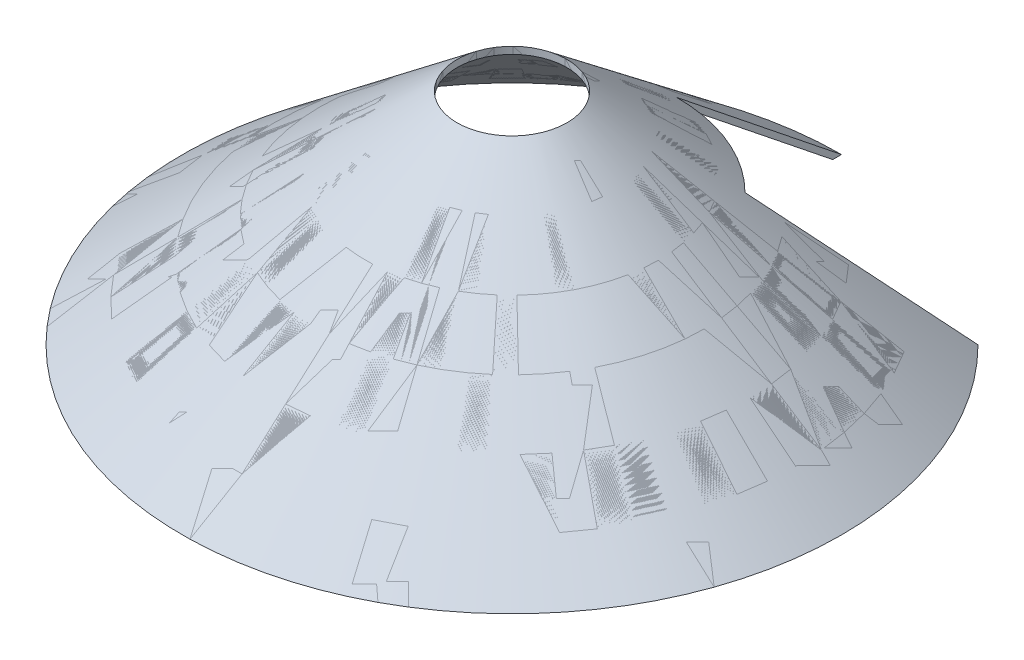
ISO-10303-21;
HEADER;
FILE_DESCRIPTION(('STEP AP214'),'2;1');
FILE_NAME('part.step','',(''),(''),'','','');
FILE_SCHEMA(('AUTOMOTIVE_DESIGN { 1 0 10303 214 1 1 1 1 }'));
ENDSEC;
DATA;
#1=APPLICATION_CONTEXT('core data for automotive mechanical design processes');
#2=APPLICATION_PROTOCOL_DEFINITION('international standard','automotive_design',2000,#1);
#3=PRODUCT_CONTEXT('',#1,'mechanical');
#4=PRODUCT('Part','Part','',(#3));
#5=PRODUCT_RELATED_PRODUCT_CATEGORY('part','',(#4));
#6=PRODUCT_DEFINITION_FORMATION('','',#4);
#7=PRODUCT_DEFINITION_CONTEXT('part definition',#1,'design');
#8=PRODUCT_DEFINITION('design','',#6,#7);
#9=PRODUCT_DEFINITION_SHAPE('','',#8);
#10=(LENGTH_UNIT() NAMED_UNIT(*) SI_UNIT(.MILLI.,.METRE.));
#11=(NAMED_UNIT(*) PLANE_ANGLE_UNIT() SI_UNIT($,.RADIAN.));
#12=(NAMED_UNIT(*) SI_UNIT($,.STERADIAN.) SOLID_ANGLE_UNIT());
#13=UNCERTAINTY_MEASURE_WITH_UNIT(LENGTH_MEASURE(1.E-05),#10,'distance_accuracy_value','');
#14=(GEOMETRIC_REPRESENTATION_CONTEXT(3) GLOBAL_UNCERTAINTY_ASSIGNED_CONTEXT((#13)) GLOBAL_UNIT_ASSIGNED_CONTEXT((#10,
#11,#12)) REPRESENTATION_CONTEXT('',''));
#15=CARTESIAN_POINT('',(0.,0.,0.));
#16=DIRECTION('',(0.,0.,1.));
#17=DIRECTION('',(1.,0.,0.));
#18=AXIS2_PLACEMENT_3D('',#15,#16,#17);
#19=CARTESIAN_POINT('',(74.1670080546155,0.,0.));
#20=DIRECTION('',(0.,-1.,0.));
#21=DIRECTION('',(1.,0.,0.));
#22=AXIS2_PLACEMENT_3D('',#19,#20,#21);
#23=PLANE('',#22);
#24=CARTESIAN_POINT('',(0.,-2.4980018054066E-13,0.));
#25=DIRECTION('',(0.,-1.,0.));
#26=DIRECTION('',(1.,0.,0.));
#27=AXIS2_PLACEMENT_3D('',#24,#25,#26);
#28=CIRCLE('',#27,74.1670080546155);
#29=CARTESIAN_POINT('',(52.443994335736,0.,-52.4439943357358));
#30=VERTEX_POINT('',#29);
#31=CARTESIAN_POINT('',(-2.58952724580519E-13,-2.49800180540661E-13,-74.1670080546155));
#32=VERTEX_POINT('',#31);
#33=EDGE_CURVE('E103',#30,#32,#28,.T.);
#34=ORIENTED_EDGE('',*,*,#33,.F.);
#35=DIRECTION('',(0.707106781186549,0.,-0.707106781186546));
#36=VECTOR('',#35,1.);
#37=CARTESIAN_POINT('',(37.0835040273079,-1.29068101080351E-13,-37.0835040273077));
#38=LINE('',#37,#36);
#39=CARTESIAN_POINT('',(53.881536726415,0.,-53.8815367264148));
#40=VERTEX_POINT('',#39);
#41=EDGE_CURVE('E78',#30,#40,#38,.T.);
#42=ORIENTED_EDGE('',*,*,#41,.T.);
#43=CARTESIAN_POINT('',(0.,-2.63677968348475E-13,0.));
#44=DIRECTION('',(0.,-1.,0.));
#45=DIRECTION('',(1.,0.,0.));
#46=AXIS2_PLACEMENT_3D('',#43,#44,#45);
#47=CIRCLE('',#46,76.2);
#48=CARTESIAN_POINT('',(-2.66050878019847E-13,-2.63677968348475E-13,-76.2));
#49=VERTEX_POINT('',#48);
#50=EDGE_CURVE('E123',#40,#49,#47,.T.);
#51=ORIENTED_EDGE('',*,*,#50,.T.);
#52=DIRECTION('',(0.,0.,1.));
#53=VECTOR('',#52,1.);
#54=CARTESIAN_POINT('',(0.,-2.5854446337061E-13,2.58952724580518E-13));
#55=LINE('',#54,#53);
#56=EDGE_CURVE('E70',#49,#32,#55,.T.);
#57=ORIENTED_EDGE('',*,*,#56,.T.);
#58=EDGE_LOOP('',(#34,#42,#51,#57));
#59=FACE_BOUND('',#58,.T.);
#60=ADVANCED_FACE('F56',(#59),#23,.T.);
#61=CARTESIAN_POINT('',(-1.71688729261767E-13,49.173606443692,0.));
#62=DIRECTION('',(0.,-1.,0.));
#63=DIRECTION('',(1.,0.,0.));
#64=AXIS2_PLACEMENT_3D('',#61,#62,#63);
#65=CONICAL_SURFACE('',#64,12.7000000000002,0.896055384571341);
#66=CARTESIAN_POINT('',(-1.71688729261767E-13,49.173606443692,0.));
#67=DIRECTION('',(0.,-1.,0.));
#68=DIRECTION('',(1.,0.,0.));
#69=AXIS2_PLACEMENT_3D('',#66,#67,#68);
#70=CIRCLE('',#69,12.7000000000002);
#71=CARTESIAN_POINT('',(12.7,49.173606443692,0.));
#72=VERTEX_POINT('',#71);
#73=EDGE_CURVE('E117',#72,#72,#70,.T.);
#74=ORIENTED_EDGE('',*,*,#73,.F.);
#75=EDGE_LOOP('',(#74));
#76=FACE_BOUND('',#75,.T.);
#77=CARTESIAN_POINT('',(-1.00741828456475E-13,28.853606443692,0.));
#78=DIRECTION('',(0.,-1.,0.));
#79=DIRECTION('',(1.,0.,0.));
#80=AXIS2_PLACEMENT_3D('',#77,#78,#79);
#81=CIRCLE('',#80,38.1);
#82=CARTESIAN_POINT('',(-1.33025439009923E-13,28.853606443692,-38.1));
#83=VERTEX_POINT('',#82);
#84=CARTESIAN_POINT('',(26.9407683632075,28.853606443692,-26.9407683632074));
#85=VERTEX_POINT('',#84);
#86=EDGE_CURVE('E110',#83,#85,#81,.T.);
#87=ORIENTED_EDGE('',*,*,#86,.T.);
#88=DIRECTION('',(0.552157630374233,-0.624695047554425,-0.552157630374231));
#89=VECTOR('',#88,1.);
#90=CARTESIAN_POINT('',(-1.04124862063291E-13,59.3336064436922,1.03037317601123E-13));
#91=LINE('',#90,#89);
#92=EDGE_CURVE('E126',#85,#30,#91,.T.);
#93=ORIENTED_EDGE('',*,*,#92,.T.);
#94=ORIENTED_EDGE('',*,*,#33,.T.);
#95=DIRECTION('',(0.,0.624695047554427,0.780868809443028));
#96=VECTOR('',#95,1.);
#97=CARTESIAN_POINT('',(0.,59.3336064436922,0.));
#98=LINE('',#97,#96);
#99=EDGE_CURVE('E129',#32,#83,#98,.T.);
#100=ORIENTED_EDGE('',*,*,#99,.T.);
#101=EDGE_LOOP('',(#87,#93,#94,#100));
#102=FACE_BOUND('',#101,.T.);
#103=ADVANCED_FACE('F133',(#76,#102),#65,.F.);
#104=CARTESIAN_POINT('',(0.,-2.63677968348475E-13,0.));
#105=DIRECTION('',(0.,-1.,0.));
#106=DIRECTION('',(1.,0.,0.));
#107=AXIS2_PLACEMENT_3D('',#104,#105,#106);
#108=CONICAL_SURFACE('',#107,76.2,0.89605538457134);
#109=CARTESIAN_POINT('',(-1.77367252013231E-13,50.7999999999999,0.));
#110=DIRECTION('',(0.,-1.,0.));
#111=DIRECTION('',(1.,0.,0.));
#112=AXIS2_PLACEMENT_3D('',#109,#110,#111);
#113=CIRCLE('',#112,12.7000000000002);
#114=CARTESIAN_POINT('',(12.7,50.8,0.));
#115=VERTEX_POINT('',#114);
#116=EDGE_CURVE('E120',#115,#115,#113,.T.);
#117=ORIENTED_EDGE('',*,*,#116,.T.);
#118=EDGE_LOOP('',(#117));
#119=FACE_BOUND('',#118,.T.);
#120=ORIENTED_EDGE('',*,*,#50,.F.);
#121=DIRECTION('',(0.552157630374233,-0.624695047554425,-0.552157630374231));
#122=VECTOR('',#121,1.);
#123=CARTESIAN_POINT('',(-1.07350115348062E-13,60.9600000000002,1.05490587067816E-13));
#124=LINE('',#123,#122);
#125=CARTESIAN_POINT('',(26.9407683632075,30.48,-26.9407683632074));
#126=VERTEX_POINT('',#125);
#127=EDGE_CURVE('E14',#40,#126,#124,.F.);
#128=ORIENTED_EDGE('',*,*,#127,.T.);
#129=CARTESIAN_POINT('',(-1.06420351207939E-13,30.48,0.));
#130=DIRECTION('',(0.,-1.,0.));
#131=DIRECTION('',(1.,0.,0.));
#132=AXIS2_PLACEMENT_3D('',#129,#130,#131);
#133=CIRCLE('',#132,38.1);
#134=CARTESIAN_POINT('',(-1.33025439009923E-13,30.48,-38.1));
#135=VERTEX_POINT('',#134);
#136=EDGE_CURVE('E63',#126,#135,#133,.F.);
#137=ORIENTED_EDGE('',*,*,#136,.T.);
#138=DIRECTION('',(0.,0.624695047554427,0.780868809443028));
#139=VECTOR('',#138,1.);
#140=CARTESIAN_POINT('',(0.,60.9600000000002,0.));
#141=LINE('',#140,#139);
#142=EDGE_CURVE('E94',#135,#49,#141,.F.);
#143=ORIENTED_EDGE('',*,*,#142,.T.);
#144=EDGE_LOOP('',(#120,#128,#137,#143));
#145=FACE_BOUND('',#144,.T.);
#146=ADVANCED_FACE('F113',(#119,#145),#108,.T.);
#147=CARTESIAN_POINT('',(3.00267569941428E-13,-86.0000500649728,0.));
#148=DIRECTION('',(0.,-1.,0.));
#149=DIRECTION('',(1.,0.,0.));
#150=AXIS2_PLACEMENT_3D('',#147,#148,#149);
#151=CYLINDRICAL_SURFACE('',#150,12.7000000000002);
#152=ORIENTED_EDGE('',*,*,#73,.T.);
#153=EDGE_LOOP('',(#152));
#154=FACE_BOUND('',#153,.T.);
#155=ORIENTED_EDGE('',*,*,#116,.F.);
#156=EDGE_LOOP('',(#155));
#157=FACE_BOUND('',#156,.T.);
#158=ADVANCED_FACE('F144',(#154,#157),#151,.F.);
#159=CARTESIAN_POINT('',(0.,76.2,0.));
#160=DIRECTION('',(0.,-1.,0.));
#161=DIRECTION('',(0.,0.,-1.));
#162=AXIS2_PLACEMENT_3D('',#159,#160,#161);
#163=CYLINDRICAL_SURFACE('',#162,38.1);
#164=DIRECTION('',(0.,-1.,0.));
#165=VECTOR('',#164,1.);
#166=CARTESIAN_POINT('',(-1.33025439009923E-13,76.2,-38.1));
#167=LINE('',#166,#165);
#168=EDGE_CURVE('E97',#135,#83,#167,.T.);
#169=ORIENTED_EDGE('',*,*,#168,.F.);
#170=ORIENTED_EDGE('',*,*,#136,.F.);
#171=DIRECTION('',(0.,-1.,0.));
#172=VECTOR('',#171,1.);
#173=CARTESIAN_POINT('',(26.9407683632075,76.2,-26.9407683632074));
#174=LINE('',#173,#172);
#175=EDGE_CURVE('E111',#126,#85,#174,.T.);
#176=ORIENTED_EDGE('',*,*,#175,.T.);
#177=ORIENTED_EDGE('',*,*,#86,.F.);
#178=EDGE_LOOP('',(#169,#170,#176,#177));
#179=FACE_BOUND('',#178,.T.);
#180=ADVANCED_FACE('F106',(#179),#163,.T.);
#181=CARTESIAN_POINT('',(26.9407683632075,76.2,-26.9407683632074));
#182=DIRECTION('',(-0.707106781186546,0.,-0.707106781186549));
#183=DIRECTION('',(-0.707106781186549,0.,0.707106781186546));
#184=AXIS2_PLACEMENT_3D('',#181,#182,#183);
#185=PLANE('',#184);
#186=ORIENTED_EDGE('',*,*,#175,.F.);
#187=ORIENTED_EDGE('',*,*,#127,.F.);
#188=ORIENTED_EDGE('',*,*,#41,.F.);
#189=ORIENTED_EDGE('',*,*,#92,.F.);
#190=EDGE_LOOP('',(#186,#187,#188,#189));
#191=FACE_BOUND('',#190,.T.);
#192=ADVANCED_FACE('F154',(#191),#185,.T.);
#193=CARTESIAN_POINT('',(-1.33025439009923E-13,76.2,-38.1));
#194=DIRECTION('',(1.,0.,0.));
#195=DIRECTION('',(0.,0.,-1.));
#196=AXIS2_PLACEMENT_3D('',#193,#194,#195);
#197=PLANE('',#196);
#198=ORIENTED_EDGE('',*,*,#56,.F.);
#199=ORIENTED_EDGE('',*,*,#142,.F.);
#200=ORIENTED_EDGE('',*,*,#168,.T.);
#201=ORIENTED_EDGE('',*,*,#99,.F.);
#202=EDGE_LOOP('',(#198,#199,#200,#201));
#203=FACE_BOUND('',#202,.T.);
#204=ADVANCED_FACE('F96',(#203),#197,.T.);
#205=CLOSED_SHELL('',(#60,#103,#146,#158,#180,#192,#204));
#206=MANIFOLD_SOLID_BREP('B2',#205);
#207=CARTESIAN_POINT('',(0.,1.27000000000024,0.));
#208=DIRECTION('',(0.,-1.,0.));
#209=DIRECTION('',(1.,0.,0.));
#210=AXIS2_PLACEMENT_3D('',#207,#208,#209);
#211=CONICAL_SURFACE('',#210,72.5795080546151,0.896055384571347);
#212=CARTESIAN_POINT('',(-1.71688729261767E-13,49.1736064436921,0.));
#213=DIRECTION('',(0.,-1.,0.));
#214=DIRECTION('',(1.,0.,0.));
#215=AXIS2_PLACEMENT_3D('',#212,#213,#214);
#216=CIRCLE('',#215,12.6999999999998);
#217=CARTESIAN_POINT('',(12.6999999999996,49.1736064436921,0.));
#218=VERTEX_POINT('',#217);
#219=EDGE_CURVE('E281',#218,#218,#216,.T.);
#220=ORIENTED_EDGE('',*,*,#219,.F.);
#221=EDGE_LOOP('',(#220));
#222=FACE_BOUND('',#221,.T.);
#223=DIRECTION('',(0.552157630374237,-0.62469504755442,-0.552157630374234));
#224=VECTOR('',#223,1.);
#225=CARTESIAN_POINT('',(-1.0412486206329E-13,59.3336064436919,1.03037317601123E-13));
#226=LINE('',#225,#224);
#227=CARTESIAN_POINT('',(52.4439943357357,4.46785195906091E-13,-52.4439943357355));
#228=VERTEX_POINT('',#227);
#229=CARTESIAN_POINT('',(26.9407683632075,28.8536064436921,-26.9407683632074));
#230=VERTEX_POINT('',#229);
#231=EDGE_CURVE('E268',#228,#230,#226,.F.);
#232=ORIENTED_EDGE('',*,*,#231,.F.);
#233=CARTESIAN_POINT('',(0.,2.63677968348475E-13,0.));
#234=DIRECTION('',(0.,-1.,0.));
#235=DIRECTION('',(1.,0.,0.));
#236=AXIS2_PLACEMENT_3D('',#233,#234,#235);
#237=CIRCLE('',#236,74.1670080546151);
#238=CARTESIAN_POINT('',(-2.58952724580516E-13,2.63677968348474E-13,-74.1670080546151));
#239=VERTEX_POINT('',#238);
#240=EDGE_CURVE('E274',#228,#239,#237,.T.);
#241=ORIENTED_EDGE('',*,*,#240,.T.);
#242=DIRECTION('',(0.,0.624695047554422,0.780868809443032));
#243=VECTOR('',#242,1.);
#244=CARTESIAN_POINT('',(0.,59.3336064436919,0.));
#245=LINE('',#244,#243);
#246=CARTESIAN_POINT('',(-1.33025439009923E-13,28.8536064436921,-38.1));
#247=VERTEX_POINT('',#246);
#248=EDGE_CURVE('E223',#247,#239,#245,.F.);
#249=ORIENTED_EDGE('',*,*,#248,.F.);
#250=CARTESIAN_POINT('',(-1.00741828456475E-13,28.8536064436921,0.));
#251=DIRECTION('',(0.,-1.,0.));
#252=DIRECTION('',(1.,0.,0.));
#253=AXIS2_PLACEMENT_3D('',#250,#251,#252);
#254=CIRCLE('',#253,38.1);
#255=EDGE_CURVE('E262',#230,#247,#254,.F.);
#256=ORIENTED_EDGE('',*,*,#255,.F.);
#257=EDGE_LOOP('',(#232,#241,#249,#256));
#258=FACE_BOUND('',#257,.T.);
#259=ADVANCED_FACE('F209',(#222,#258),#211,.F.);
#260=CARTESIAN_POINT('',(-1.77367252013231E-13,50.8000000000001,0.));
#261=DIRECTION('',(0.,-1.,0.));
#262=DIRECTION('',(1.,0.,0.));
#263=AXIS2_PLACEMENT_3D('',#260,#261,#262);
#264=CONICAL_SURFACE('',#263,12.6999999999998,0.896055384571347);
#265=CARTESIAN_POINT('',(-1.77367252013231E-13,50.8000000000001,0.));
#266=DIRECTION('',(0.,-1.,0.));
#267=DIRECTION('',(1.,0.,0.));
#268=AXIS2_PLACEMENT_3D('',#265,#266,#267);
#269=CIRCLE('',#268,12.6999999999998);
#270=CARTESIAN_POINT('',(12.6999999999996,50.8000000000001,0.));
#271=VERTEX_POINT('',#270);
#272=EDGE_CURVE('E278',#271,#271,#269,.T.);
#273=ORIENTED_EDGE('',*,*,#272,.T.);
#274=EDGE_LOOP('',(#273));
#275=FACE_BOUND('',#274,.T.);
#276=DIRECTION('',(0.552157630374237,-0.62469504755442,-0.552157630374234));
#277=VECTOR('',#276,1.);
#278=CARTESIAN_POINT('',(-1.07350115348061E-13,60.9599999999998,1.05490587067816E-13));
#279=LINE('',#278,#277);
#280=CARTESIAN_POINT('',(26.9407683632075,30.4800000000001,-26.9407683632074));
#281=VERTEX_POINT('',#280);
#282=CARTESIAN_POINT('',(53.881536726415,0.,-53.8815367264148));
#283=VERTEX_POINT('',#282);
#284=EDGE_CURVE('E266',#281,#283,#279,.T.);
#285=ORIENTED_EDGE('',*,*,#284,.F.);
#286=CARTESIAN_POINT('',(-1.06420351207939E-13,30.4800000000001,0.));
#287=DIRECTION('',(0.,-1.,0.));
#288=DIRECTION('',(1.,0.,0.));
#289=AXIS2_PLACEMENT_3D('',#286,#287,#288);
#290=CIRCLE('',#289,38.1);
#291=CARTESIAN_POINT('',(-1.33025439009923E-13,30.4800000000001,-38.1));
#292=VERTEX_POINT('',#291);
#293=EDGE_CURVE('E54',#292,#281,#290,.T.);
#294=ORIENTED_EDGE('',*,*,#293,.F.);
#295=DIRECTION('',(0.,0.624695047554422,0.780868809443032));
#296=VECTOR('',#295,1.);
#297=CARTESIAN_POINT('',(0.,60.9599999999998,0.));
#298=LINE('',#297,#296);
#299=CARTESIAN_POINT('',(-2.66050878019847E-13,2.91433543964104E-13,-76.2));
#300=VERTEX_POINT('',#299);
#301=EDGE_CURVE('E246',#300,#292,#298,.T.);
#302=ORIENTED_EDGE('',*,*,#301,.F.);
#303=CARTESIAN_POINT('',(0.,2.63677968348475E-13,0.));
#304=DIRECTION('',(0.,-1.,0.));
#305=DIRECTION('',(1.,0.,0.));
#306=AXIS2_PLACEMENT_3D('',#303,#304,#305);
#307=CIRCLE('',#306,76.2);
#308=EDGE_CURVE('E267',#283,#300,#307,.T.);
#309=ORIENTED_EDGE('',*,*,#308,.F.);
#310=EDGE_LOOP('',(#285,#294,#302,#309));
#311=FACE_BOUND('',#310,.T.);
#312=ADVANCED_FACE('F265',(#275,#311),#264,.T.);
#313=CARTESIAN_POINT('',(-76.2,0.,0.));
#314=DIRECTION('',(0.,1.,0.));
#315=DIRECTION('',(-1.,0.,0.));
#316=AXIS2_PLACEMENT_3D('',#313,#314,#315);
#317=PLANE('',#316);
#318=DIRECTION('',(-0.707106781186549,0.,0.707106781186546));
#319=VECTOR('',#318,1.);
#320=CARTESIAN_POINT('',(-38.1000000000002,1.30560564462743E-13,38.1));
#321=LINE('',#320,#319);
#322=EDGE_CURVE('E216',#283,#228,#321,.T.);
#323=ORIENTED_EDGE('',*,*,#322,.F.);
#324=ORIENTED_EDGE('',*,*,#308,.T.);
#325=DIRECTION('',(0.,0.,-1.));
#326=VECTOR('',#325,1.);
#327=CARTESIAN_POINT('',(0.,2.63586003472667E-13,-2.66050878019847E-13));
#328=LINE('',#327,#326);
#329=EDGE_CURVE('E250',#239,#300,#328,.T.);
#330=ORIENTED_EDGE('',*,*,#329,.F.);
#331=ORIENTED_EDGE('',*,*,#240,.F.);
#332=EDGE_LOOP('',(#323,#324,#330,#331));
#333=FACE_BOUND('',#332,.T.);
#334=ADVANCED_FACE('F292',(#333),#317,.F.);
#335=CARTESIAN_POINT('',(3.00267569941428E-13,-86.0000500649728,0.));
#336=DIRECTION('',(0.,-1.,0.));
#337=DIRECTION('',(1.,0.,0.));
#338=AXIS2_PLACEMENT_3D('',#335,#336,#337);
#339=CYLINDRICAL_SURFACE('',#338,12.6999999999998);
#340=ORIENTED_EDGE('',*,*,#272,.F.);
#341=EDGE_LOOP('',(#340));
#342=FACE_BOUND('',#341,.T.);
#343=ORIENTED_EDGE('',*,*,#219,.T.);
#344=EDGE_LOOP('',(#343));
#345=FACE_BOUND('',#344,.T.);
#346=ADVANCED_FACE('F286',(#342,#345),#339,.F.);
#347=CARTESIAN_POINT('',(0.,76.2,0.));
#348=DIRECTION('',(0.,-1.,0.));
#349=DIRECTION('',(0.,0.,-1.));
#350=AXIS2_PLACEMENT_3D('',#347,#348,#349);
#351=CYLINDRICAL_SURFACE('',#350,38.1);
#352=ORIENTED_EDGE('',*,*,#255,.T.);
#353=DIRECTION('',(0.,-1.,0.));
#354=VECTOR('',#353,1.);
#355=CARTESIAN_POINT('',(-1.33025439009923E-13,76.2,-38.1));
#356=LINE('',#355,#354);
#357=EDGE_CURVE('E249',#292,#247,#356,.T.);
#358=ORIENTED_EDGE('',*,*,#357,.F.);
#359=ORIENTED_EDGE('',*,*,#293,.T.);
#360=DIRECTION('',(0.,-1.,0.));
#361=VECTOR('',#360,1.);
#362=CARTESIAN_POINT('',(26.9407683632075,76.2,-26.9407683632074));
#363=LINE('',#362,#361);
#364=EDGE_CURVE('E255',#281,#230,#363,.T.);
#365=ORIENTED_EDGE('',*,*,#364,.T.);
#366=EDGE_LOOP('',(#352,#358,#359,#365));
#367=FACE_BOUND('',#366,.T.);
#368=ADVANCED_FACE('F258',(#367),#351,.T.);
#369=CARTESIAN_POINT('',(26.9407683632075,76.2,-26.9407683632074));
#370=DIRECTION('',(-0.707106781186546,0.,-0.707106781186549));
#371=DIRECTION('',(-0.707106781186549,0.,0.707106781186546));
#372=AXIS2_PLACEMENT_3D('',#369,#370,#371);
#373=PLANE('',#372);
#374=ORIENTED_EDGE('',*,*,#231,.T.);
#375=ORIENTED_EDGE('',*,*,#364,.F.);
#376=ORIENTED_EDGE('',*,*,#284,.T.);
#377=ORIENTED_EDGE('',*,*,#322,.T.);
#378=EDGE_LOOP('',(#374,#375,#376,#377));
#379=FACE_BOUND('',#378,.T.);
#380=ADVANCED_FACE('F305',(#379),#373,.T.);
#381=CARTESIAN_POINT('',(-1.33025439009923E-13,76.2,-38.1));
#382=DIRECTION('',(1.,0.,0.));
#383=DIRECTION('',(0.,0.,-1.));
#384=AXIS2_PLACEMENT_3D('',#381,#382,#383);
#385=PLANE('',#384);
#386=ORIENTED_EDGE('',*,*,#248,.T.);
#387=ORIENTED_EDGE('',*,*,#329,.T.);
#388=ORIENTED_EDGE('',*,*,#301,.T.);
#389=ORIENTED_EDGE('',*,*,#357,.T.);
#390=EDGE_LOOP('',(#386,#387,#388,#389));
#391=FACE_BOUND('',#390,.T.);
#392=ADVANCED_FACE('F248',(#391),#385,.T.);
#393=CLOSED_SHELL('',(#259,#312,#334,#346,#368,#380,#392));
#394=MANIFOLD_SOLID_BREP('B8',#393);
#395=ADVANCED_BREP_SHAPE_REPRESENTATION('',(#18,#206,#394),#14);
#396=SHAPE_DEFINITION_REPRESENTATION(#9,#395);
ENDSEC;
END-ISO-10303-21;
